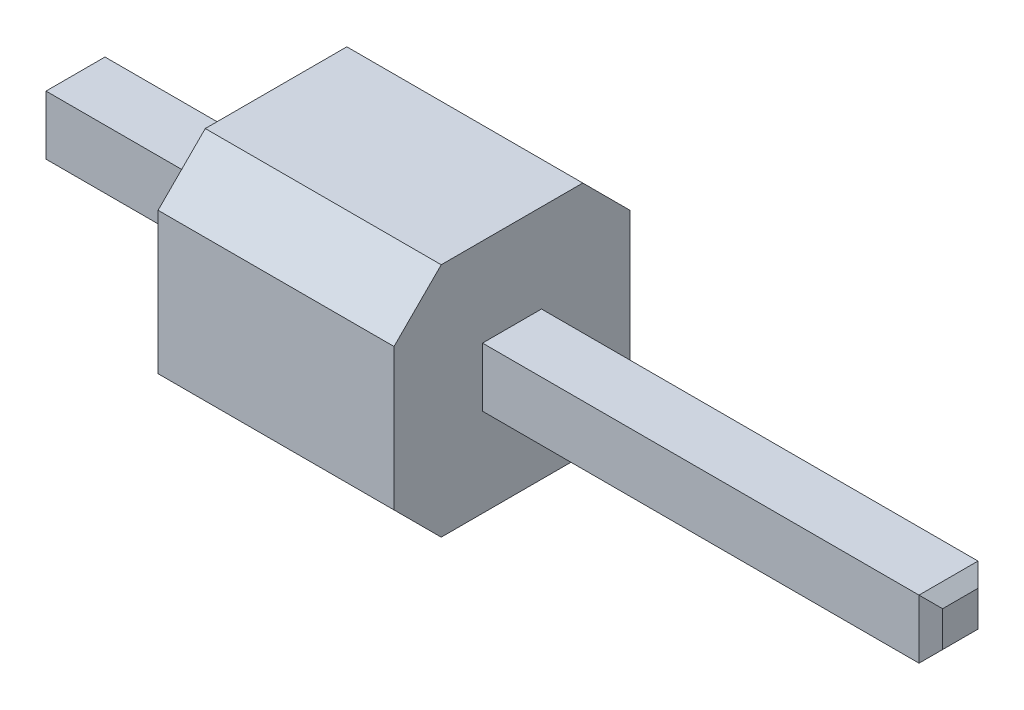
ISO-10303-21;
HEADER;
FILE_DESCRIPTION(('STEP AP214'),'2;1');
FILE_NAME('part.step','',(''),(''),'','','');
FILE_SCHEMA(('AUTOMOTIVE_DESIGN { 1 0 10303 214 1 1 1 1 }'));
ENDSEC;
DATA;
#1=APPLICATION_CONTEXT('core data for automotive mechanical design processes');
#2=APPLICATION_PROTOCOL_DEFINITION('international standard','automotive_design',2000,#1);
#3=PRODUCT_CONTEXT('',#1,'mechanical');
#4=PRODUCT('Part','Part','',(#3));
#5=PRODUCT_RELATED_PRODUCT_CATEGORY('part','',(#4));
#6=PRODUCT_DEFINITION_FORMATION('','',#4);
#7=PRODUCT_DEFINITION_CONTEXT('part definition',#1,'design');
#8=PRODUCT_DEFINITION('design','',#6,#7);
#9=PRODUCT_DEFINITION_SHAPE('','',#8);
#10=(LENGTH_UNIT() NAMED_UNIT(*) SI_UNIT(.MILLI.,.METRE.));
#11=(NAMED_UNIT(*) PLANE_ANGLE_UNIT() SI_UNIT($,.RADIAN.));
#12=(NAMED_UNIT(*) SI_UNIT($,.STERADIAN.) SOLID_ANGLE_UNIT());
#13=UNCERTAINTY_MEASURE_WITH_UNIT(LENGTH_MEASURE(1.E-05),#10,'distance_accuracy_value','');
#14=(GEOMETRIC_REPRESENTATION_CONTEXT(3) GLOBAL_UNCERTAINTY_ASSIGNED_CONTEXT((#13)) GLOBAL_UNIT_ASSIGNED_CONTEXT((#10,
#11,#12)) REPRESENTATION_CONTEXT('',''));
#15=CARTESIAN_POINT('',(0.,0.,0.));
#16=DIRECTION('',(0.,0.,1.));
#17=DIRECTION('',(1.,0.,0.));
#18=AXIS2_PLACEMENT_3D('',#15,#16,#17);
#19=CARTESIAN_POINT('',(2.,1.,1.6));
#20=DIRECTION('',(0.,-0.707106781186549,-0.707106781186546));
#21=DIRECTION('',(0.,0.707106781186546,-0.707106781186549));
#22=AXIS2_PLACEMENT_3D('',#19,#20,#21);
#23=PLANE('',#22);
#24=DIRECTION('',(0.,-0.707106781186546,0.707106781186549));
#25=VECTOR('',#24,1.);
#26=CARTESIAN_POINT('',(0.,1.,1.6));
#27=LINE('',#26,#25);
#28=CARTESIAN_POINT('',(0.,1.,1.6));
#29=VERTEX_POINT('',#28);
#30=CARTESIAN_POINT('',(0.,0.6,2.));
#31=VERTEX_POINT('',#30);
#32=EDGE_CURVE('E300',#29,#31,#27,.T.);
#33=ORIENTED_EDGE('',*,*,#32,.T.);
#34=DIRECTION('',(-1.,0.,0.));
#35=VECTOR('',#34,1.);
#36=CARTESIAN_POINT('',(2.,0.6,2.));
#37=LINE('',#36,#35);
#38=CARTESIAN_POINT('',(2.,0.6,2.));
#39=VERTEX_POINT('',#38);
#40=EDGE_CURVE('E196',#39,#31,#37,.T.);
#41=ORIENTED_EDGE('',*,*,#40,.F.);
#42=DIRECTION('',(0.,-0.707106781186546,0.707106781186549));
#43=VECTOR('',#42,1.);
#44=CARTESIAN_POINT('',(2.,1.,1.6));
#45=LINE('',#44,#43);
#46=CARTESIAN_POINT('',(2.,1.,1.6));
#47=VERTEX_POINT('',#46);
#48=EDGE_CURVE('E301',#47,#39,#45,.T.);
#49=ORIENTED_EDGE('',*,*,#48,.F.);
#50=DIRECTION('',(-1.,0.,0.));
#51=VECTOR('',#50,1.);
#52=CARTESIAN_POINT('',(2.,1.,1.6));
#53=LINE('',#52,#51);
#54=EDGE_CURVE('E319',#47,#29,#53,.T.);
#55=ORIENTED_EDGE('',*,*,#54,.T.);
#56=EDGE_LOOP('',(#33,#41,#49,#55));
#57=FACE_BOUND('',#56,.T.);
#58=ADVANCED_FACE('F35',(#57),#23,.F.);
#59=CARTESIAN_POINT('',(2.,0.6,2.));
#60=DIRECTION('',(0.,0.,-1.));
#61=DIRECTION('',(-1.,0.,0.));
#62=AXIS2_PLACEMENT_3D('',#59,#60,#61);
#63=PLANE('',#62);
#64=DIRECTION('',(0.,-1.,0.));
#65=VECTOR('',#64,1.);
#66=CARTESIAN_POINT('',(0.,0.6,2.));
#67=LINE('',#66,#65);
#68=CARTESIAN_POINT('',(0.,-0.6,2.));
#69=VERTEX_POINT('',#68);
#70=EDGE_CURVE('E322',#31,#69,#67,.T.);
#71=ORIENTED_EDGE('',*,*,#70,.T.);
#72=DIRECTION('',(-1.,0.,0.));
#73=VECTOR('',#72,1.);
#74=CARTESIAN_POINT('',(2.,-0.6,2.));
#75=LINE('',#74,#73);
#76=CARTESIAN_POINT('',(2.,-0.6,2.));
#77=VERTEX_POINT('',#76);
#78=EDGE_CURVE('E352',#77,#69,#75,.T.);
#79=ORIENTED_EDGE('',*,*,#78,.F.);
#80=DIRECTION('',(0.,-1.,0.));
#81=VECTOR('',#80,1.);
#82=CARTESIAN_POINT('',(2.,0.6,2.));
#83=LINE('',#82,#81);
#84=EDGE_CURVE('E304',#39,#77,#83,.T.);
#85=ORIENTED_EDGE('',*,*,#84,.F.);
#86=ORIENTED_EDGE('',*,*,#40,.T.);
#87=EDGE_LOOP('',(#71,#79,#85,#86));
#88=FACE_BOUND('',#87,.T.);
#89=ADVANCED_FACE('F358',(#88),#63,.F.);
#90=CARTESIAN_POINT('',(2.,-1.,1.6));
#91=DIRECTION('',(0.,0.707106781186549,-0.707106781186546));
#92=DIRECTION('',(0.,0.707106781186546,0.707106781186549));
#93=AXIS2_PLACEMENT_3D('',#90,#91,#92);
#94=PLANE('',#93);
#95=DIRECTION('',(0.,-0.707106781186546,-0.707106781186549));
#96=VECTOR('',#95,1.);
#97=CARTESIAN_POINT('',(0.,-1.,1.6));
#98=LINE('',#97,#96);
#99=CARTESIAN_POINT('',(0.,-1.,1.6));
#100=VERTEX_POINT('',#99);
#101=EDGE_CURVE('E324',#69,#100,#98,.T.);
#102=ORIENTED_EDGE('',*,*,#101,.T.);
#103=DIRECTION('',(-1.,0.,0.));
#104=VECTOR('',#103,1.);
#105=CARTESIAN_POINT('',(2.,-1.,1.6));
#106=LINE('',#105,#104);
#107=CARTESIAN_POINT('',(2.,-1.,1.6));
#108=VERTEX_POINT('',#107);
#109=EDGE_CURVE('E349',#108,#100,#106,.T.);
#110=ORIENTED_EDGE('',*,*,#109,.F.);
#111=DIRECTION('',(0.,-0.707106781186546,-0.707106781186549));
#112=VECTOR('',#111,1.);
#113=CARTESIAN_POINT('',(2.,-1.,1.6));
#114=LINE('',#113,#112);
#115=EDGE_CURVE('E307',#77,#108,#114,.T.);
#116=ORIENTED_EDGE('',*,*,#115,.F.);
#117=ORIENTED_EDGE('',*,*,#78,.T.);
#118=EDGE_LOOP('',(#102,#110,#116,#117));
#119=FACE_BOUND('',#118,.T.);
#120=ADVANCED_FACE('F371',(#119),#94,.F.);
#121=CARTESIAN_POINT('',(2.,-1.,1.6));
#122=DIRECTION('',(0.,1.,0.));
#123=DIRECTION('',(0.,0.,1.));
#124=AXIS2_PLACEMENT_3D('',#121,#122,#123);
#125=PLANE('',#124);
#126=DIRECTION('',(0.,0.,-1.));
#127=VECTOR('',#126,1.);
#128=CARTESIAN_POINT('',(0.,-1.,1.6));
#129=LINE('',#128,#127);
#130=CARTESIAN_POINT('',(0.,-1.,0.400000000000001));
#131=VERTEX_POINT('',#130);
#132=EDGE_CURVE('E326',#100,#131,#129,.T.);
#133=ORIENTED_EDGE('',*,*,#132,.T.);
#134=DIRECTION('',(-1.,0.,0.));
#135=VECTOR('',#134,1.);
#136=CARTESIAN_POINT('',(2.,-1.,0.400000000000001));
#137=LINE('',#136,#135);
#138=CARTESIAN_POINT('',(2.,-1.,0.400000000000001));
#139=VERTEX_POINT('',#138);
#140=EDGE_CURVE('E346',#139,#131,#137,.T.);
#141=ORIENTED_EDGE('',*,*,#140,.F.);
#142=DIRECTION('',(0.,0.,-1.));
#143=VECTOR('',#142,1.);
#144=CARTESIAN_POINT('',(2.,-1.,1.6));
#145=LINE('',#144,#143);
#146=EDGE_CURVE('E309',#108,#139,#145,.T.);
#147=ORIENTED_EDGE('',*,*,#146,.F.);
#148=ORIENTED_EDGE('',*,*,#109,.T.);
#149=EDGE_LOOP('',(#133,#141,#147,#148));
#150=FACE_BOUND('',#149,.T.);
#151=ADVANCED_FACE('F375',(#150),#125,.F.);
#152=CARTESIAN_POINT('',(2.,-1.,0.400000000000001));
#153=DIRECTION('',(0.,0.707106781186549,0.707106781186546));
#154=DIRECTION('',(0.,-0.707106781186546,0.707106781186549));
#155=AXIS2_PLACEMENT_3D('',#152,#153,#154);
#156=PLANE('',#155);
#157=DIRECTION('',(0.,0.707106781186546,-0.707106781186549));
#158=VECTOR('',#157,1.);
#159=CARTESIAN_POINT('',(0.,-1.,0.400000000000001));
#160=LINE('',#159,#158);
#161=CARTESIAN_POINT('',(0.,-0.6,0.));
#162=VERTEX_POINT('',#161);
#163=EDGE_CURVE('E328',#131,#162,#160,.T.);
#164=ORIENTED_EDGE('',*,*,#163,.T.);
#165=DIRECTION('',(-1.,0.,0.));
#166=VECTOR('',#165,1.);
#167=CARTESIAN_POINT('',(2.,-0.6,0.));
#168=LINE('',#167,#166);
#169=CARTESIAN_POINT('',(2.,-0.6,0.));
#170=VERTEX_POINT('',#169);
#171=EDGE_CURVE('E343',#170,#162,#168,.T.);
#172=ORIENTED_EDGE('',*,*,#171,.F.);
#173=DIRECTION('',(0.,0.707106781186546,-0.707106781186549));
#174=VECTOR('',#173,1.);
#175=CARTESIAN_POINT('',(2.,-1.,0.400000000000001));
#176=LINE('',#175,#174);
#177=EDGE_CURVE('E311',#139,#170,#176,.T.);
#178=ORIENTED_EDGE('',*,*,#177,.F.);
#179=ORIENTED_EDGE('',*,*,#140,.T.);
#180=EDGE_LOOP('',(#164,#172,#178,#179));
#181=FACE_BOUND('',#180,.T.);
#182=ADVANCED_FACE('F394',(#181),#156,.F.);
#183=CARTESIAN_POINT('',(2.,0.6,0.));
#184=DIRECTION('',(0.,0.,1.));
#185=DIRECTION('',(0.,-1.,0.));
#186=AXIS2_PLACEMENT_3D('',#183,#184,#185);
#187=PLANE('',#186);
#188=DIRECTION('',(0.,1.,0.));
#189=VECTOR('',#188,1.);
#190=CARTESIAN_POINT('',(0.,0.6,0.));
#191=LINE('',#190,#189);
#192=CARTESIAN_POINT('',(0.,0.6,0.));
#193=VERTEX_POINT('',#192);
#194=EDGE_CURVE('E330',#162,#193,#191,.T.);
#195=ORIENTED_EDGE('',*,*,#194,.T.);
#196=DIRECTION('',(-1.,0.,0.));
#197=VECTOR('',#196,1.);
#198=CARTESIAN_POINT('',(2.,0.6,0.));
#199=LINE('',#198,#197);
#200=CARTESIAN_POINT('',(2.,0.6,0.));
#201=VERTEX_POINT('',#200);
#202=EDGE_CURVE('E340',#201,#193,#199,.T.);
#203=ORIENTED_EDGE('',*,*,#202,.F.);
#204=DIRECTION('',(0.,1.,0.));
#205=VECTOR('',#204,1.);
#206=CARTESIAN_POINT('',(2.,0.6,0.));
#207=LINE('',#206,#205);
#208=EDGE_CURVE('E313',#170,#201,#207,.T.);
#209=ORIENTED_EDGE('',*,*,#208,.F.);
#210=ORIENTED_EDGE('',*,*,#171,.T.);
#211=EDGE_LOOP('',(#195,#203,#209,#210));
#212=FACE_BOUND('',#211,.T.);
#213=ADVANCED_FACE('F391',(#212),#187,.F.);
#214=CARTESIAN_POINT('',(2.,1.,0.400000000000001));
#215=DIRECTION('',(0.,-0.707106781186549,0.707106781186546));
#216=DIRECTION('',(0.,-0.707106781186546,-0.707106781186549));
#217=AXIS2_PLACEMENT_3D('',#214,#215,#216);
#218=PLANE('',#217);
#219=DIRECTION('',(0.,0.707106781186546,0.707106781186549));
#220=VECTOR('',#219,1.);
#221=CARTESIAN_POINT('',(0.,1.,0.400000000000001));
#222=LINE('',#221,#220);
#223=CARTESIAN_POINT('',(0.,1.,0.400000000000001));
#224=VERTEX_POINT('',#223);
#225=EDGE_CURVE('E332',#193,#224,#222,.T.);
#226=ORIENTED_EDGE('',*,*,#225,.T.);
#227=DIRECTION('',(-1.,0.,0.));
#228=VECTOR('',#227,1.);
#229=CARTESIAN_POINT('',(2.,1.,0.400000000000001));
#230=LINE('',#229,#228);
#231=CARTESIAN_POINT('',(2.,1.,0.400000000000001));
#232=VERTEX_POINT('',#231);
#233=EDGE_CURVE('E337',#232,#224,#230,.T.);
#234=ORIENTED_EDGE('',*,*,#233,.F.);
#235=DIRECTION('',(0.,0.707106781186546,0.707106781186549));
#236=VECTOR('',#235,1.);
#237=CARTESIAN_POINT('',(2.,1.,0.400000000000001));
#238=LINE('',#237,#236);
#239=EDGE_CURVE('E315',#201,#232,#238,.T.);
#240=ORIENTED_EDGE('',*,*,#239,.F.);
#241=ORIENTED_EDGE('',*,*,#202,.T.);
#242=EDGE_LOOP('',(#226,#234,#240,#241));
#243=FACE_BOUND('',#242,.T.);
#244=ADVANCED_FACE('F387',(#243),#218,.F.);
#245=CARTESIAN_POINT('',(2.,1.,1.6));
#246=DIRECTION('',(0.,-1.,0.));
#247=DIRECTION('',(0.,0.,-1.));
#248=AXIS2_PLACEMENT_3D('',#245,#246,#247);
#249=PLANE('',#248);
#250=DIRECTION('',(0.,0.,1.));
#251=VECTOR('',#250,1.);
#252=CARTESIAN_POINT('',(0.,1.,1.6));
#253=LINE('',#252,#251);
#254=EDGE_CURVE('E305',#224,#29,#253,.T.);
#255=ORIENTED_EDGE('',*,*,#254,.T.);
#256=ORIENTED_EDGE('',*,*,#54,.F.);
#257=DIRECTION('',(0.,0.,1.));
#258=VECTOR('',#257,1.);
#259=CARTESIAN_POINT('',(2.,1.,1.6));
#260=LINE('',#259,#258);
#261=EDGE_CURVE('E317',#232,#47,#260,.T.);
#262=ORIENTED_EDGE('',*,*,#261,.F.);
#263=ORIENTED_EDGE('',*,*,#233,.T.);
#264=EDGE_LOOP('',(#255,#256,#262,#263));
#265=FACE_BOUND('',#264,.T.);
#266=ADVANCED_FACE('F385',(#265),#249,.F.);
#267=CARTESIAN_POINT('',(2.,0.,0.));
#268=DIRECTION('',(-1.,0.,0.));
#269=DIRECTION('',(0.,0.,1.));
#270=AXIS2_PLACEMENT_3D('',#267,#268,#269);
#271=PLANE('',#270);
#272=DIRECTION('',(0.,-1.,0.));
#273=VECTOR('',#272,1.);
#274=CARTESIAN_POINT('',(2.,0.,1.25));
#275=LINE('',#274,#273);
#276=CARTESIAN_POINT('',(2.,0.25,1.25));
#277=VERTEX_POINT('',#276);
#278=CARTESIAN_POINT('',(2.,-0.25,1.25));
#279=VERTEX_POINT('',#278);
#280=EDGE_CURVE('E297',#277,#279,#275,.T.);
#281=ORIENTED_EDGE('',*,*,#280,.F.);
#282=DIRECTION('',(0.,0.,-1.));
#283=VECTOR('',#282,1.);
#284=CARTESIAN_POINT('',(2.,0.25,0.));
#285=LINE('',#284,#283);
#286=CARTESIAN_POINT('',(2.,0.25,0.75));
#287=VERTEX_POINT('',#286);
#288=EDGE_CURVE('E287',#277,#287,#285,.T.);
#289=ORIENTED_EDGE('',*,*,#288,.T.);
#290=DIRECTION('',(0.,1.,0.));
#291=VECTOR('',#290,1.);
#292=CARTESIAN_POINT('',(2.,0.,0.75));
#293=LINE('',#292,#291);
#294=CARTESIAN_POINT('',(2.,-0.25,0.75));
#295=VERTEX_POINT('',#294);
#296=EDGE_CURVE('E282',#295,#287,#293,.T.);
#297=ORIENTED_EDGE('',*,*,#296,.F.);
#298=DIRECTION('',(0.,0.,-1.));
#299=VECTOR('',#298,1.);
#300=CARTESIAN_POINT('',(2.,-0.25,0.));
#301=LINE('',#300,#299);
#302=EDGE_CURVE('E283',#279,#295,#301,.T.);
#303=ORIENTED_EDGE('',*,*,#302,.F.);
#304=EDGE_LOOP('',(#281,#289,#297,#303));
#305=FACE_BOUND('',#304,.T.);
#306=ORIENTED_EDGE('',*,*,#48,.T.);
#307=ORIENTED_EDGE('',*,*,#84,.T.);
#308=ORIENTED_EDGE('',*,*,#115,.T.);
#309=ORIENTED_EDGE('',*,*,#146,.T.);
#310=ORIENTED_EDGE('',*,*,#177,.T.);
#311=ORIENTED_EDGE('',*,*,#208,.T.);
#312=ORIENTED_EDGE('',*,*,#239,.T.);
#313=ORIENTED_EDGE('',*,*,#261,.T.);
#314=EDGE_LOOP('',(#306,#307,#308,#309,#310,#311,#312,#313));
#315=FACE_BOUND('',#314,.T.);
#316=ADVANCED_FACE('F379',(#305,#315),#271,.F.);
#317=CARTESIAN_POINT('',(0.,0.,0.));
#318=DIRECTION('',(-1.,0.,0.));
#319=DIRECTION('',(0.,0.,1.));
#320=AXIS2_PLACEMENT_3D('',#317,#318,#319);
#321=PLANE('',#320);
#322=DIRECTION('',(0.,0.,-1.));
#323=VECTOR('',#322,1.);
#324=CARTESIAN_POINT('',(0.,0.25,0.));
#325=LINE('',#324,#323);
#326=CARTESIAN_POINT('',(0.,0.25,1.25));
#327=VERTEX_POINT('',#326);
#328=CARTESIAN_POINT('',(0.,0.25,0.75));
#329=VERTEX_POINT('',#328);
#330=EDGE_CURVE('E200',#327,#329,#325,.T.);
#331=ORIENTED_EDGE('',*,*,#330,.F.);
#332=DIRECTION('',(0.,-1.,0.));
#333=VECTOR('',#332,1.);
#334=CARTESIAN_POINT('',(0.,0.,1.25));
#335=LINE('',#334,#333);
#336=CARTESIAN_POINT('',(0.,-0.25,1.25));
#337=VERTEX_POINT('',#336);
#338=EDGE_CURVE('E178',#327,#337,#335,.T.);
#339=ORIENTED_EDGE('',*,*,#338,.T.);
#340=DIRECTION('',(0.,0.,-1.));
#341=VECTOR('',#340,1.);
#342=CARTESIAN_POINT('',(0.,-0.25,0.));
#343=LINE('',#342,#341);
#344=CARTESIAN_POINT('',(0.,-0.25,0.75));
#345=VERTEX_POINT('',#344);
#346=EDGE_CURVE('E189',#337,#345,#343,.T.);
#347=ORIENTED_EDGE('',*,*,#346,.T.);
#348=DIRECTION('',(0.,1.,0.));
#349=VECTOR('',#348,1.);
#350=CARTESIAN_POINT('',(0.,0.,0.75));
#351=LINE('',#350,#349);
#352=EDGE_CURVE('E195',#345,#329,#351,.T.);
#353=ORIENTED_EDGE('',*,*,#352,.T.);
#354=EDGE_LOOP('',(#331,#339,#347,#353));
#355=FACE_BOUND('',#354,.T.);
#356=ORIENTED_EDGE('',*,*,#32,.F.);
#357=ORIENTED_EDGE('',*,*,#254,.F.);
#358=ORIENTED_EDGE('',*,*,#225,.F.);
#359=ORIENTED_EDGE('',*,*,#194,.F.);
#360=ORIENTED_EDGE('',*,*,#163,.F.);
#361=ORIENTED_EDGE('',*,*,#132,.F.);
#362=ORIENTED_EDGE('',*,*,#101,.F.);
#363=ORIENTED_EDGE('',*,*,#70,.F.);
#364=EDGE_LOOP('',(#356,#357,#358,#359,#360,#361,#362,#363));
#365=FACE_BOUND('',#364,.T.);
#366=ADVANCED_FACE('F198',(#355,#365),#321,.T.);
#367=CARTESIAN_POINT('',(-1.8,0.25,0.75));
#368=DIRECTION('',(1.,0.,0.));
#369=DIRECTION('',(0.,0.,-1.));
#370=AXIS2_PLACEMENT_3D('',#367,#368,#369);
#371=PLANE('',#370);
#372=DIRECTION('',(0.,-1.,0.));
#373=VECTOR('',#372,1.);
#374=CARTESIAN_POINT('',(-1.8,0.25,0.850000000000001));
#375=LINE('',#374,#373);
#376=CARTESIAN_POINT('',(-1.8,0.149999999999999,0.850000000000001));
#377=VERTEX_POINT('',#376);
#378=CARTESIAN_POINT('',(-1.8,-0.149999999999999,0.850000000000001));
#379=VERTEX_POINT('',#378);
#380=EDGE_CURVE('E209',#377,#379,#375,.T.);
#381=ORIENTED_EDGE('',*,*,#380,.T.);
#382=DIRECTION('',(0.,0.,1.));
#383=VECTOR('',#382,1.);
#384=CARTESIAN_POINT('',(-1.8,-0.149999999999999,0.75));
#385=LINE('',#384,#383);
#386=CARTESIAN_POINT('',(-1.8,-0.149999999999999,1.15));
#387=VERTEX_POINT('',#386);
#388=EDGE_CURVE('E211',#379,#387,#385,.T.);
#389=ORIENTED_EDGE('',*,*,#388,.T.);
#390=DIRECTION('',(0.,1.,0.));
#391=VECTOR('',#390,1.);
#392=CARTESIAN_POINT('',(-1.8,0.25,1.15));
#393=LINE('',#392,#391);
#394=CARTESIAN_POINT('',(-1.8,0.149999999999999,1.15));
#395=VERTEX_POINT('',#394);
#396=EDGE_CURVE('E202',#387,#395,#393,.T.);
#397=ORIENTED_EDGE('',*,*,#396,.T.);
#398=DIRECTION('',(0.,0.,-1.));
#399=VECTOR('',#398,1.);
#400=CARTESIAN_POINT('',(-1.8,0.149999999999999,0.75));
#401=LINE('',#400,#399);
#402=EDGE_CURVE('E207',#395,#377,#401,.T.);
#403=ORIENTED_EDGE('',*,*,#402,.T.);
#404=EDGE_LOOP('',(#381,#389,#397,#403));
#405=FACE_BOUND('',#404,.T.);
#406=ADVANCED_FACE('F509',(#405),#371,.F.);
#407=CARTESIAN_POINT('',(0.,0.25,0.));
#408=DIRECTION('',(0.,1.,0.));
#409=DIRECTION('',(0.,0.,1.));
#410=AXIS2_PLACEMENT_3D('',#407,#408,#409);
#411=PLANE('',#410);
#412=DIRECTION('',(-1.,0.,0.));
#413=VECTOR('',#412,1.);
#414=CARTESIAN_POINT('',(-1.8,0.25,0.75));
#415=LINE('',#414,#413);
#416=CARTESIAN_POINT('',(-1.7,0.25,0.75));
#417=VERTEX_POINT('',#416);
#418=EDGE_CURVE('E284',#329,#417,#415,.T.);
#419=ORIENTED_EDGE('',*,*,#418,.T.);
#420=DIRECTION('',(0.,0.,1.));
#421=VECTOR('',#420,1.);
#422=CARTESIAN_POINT('',(-1.7,0.25,1.25));
#423=LINE('',#422,#421);
#424=CARTESIAN_POINT('',(-1.7,0.25,1.25));
#425=VERTEX_POINT('',#424);
#426=EDGE_CURVE('E218',#417,#425,#423,.T.);
#427=ORIENTED_EDGE('',*,*,#426,.T.);
#428=DIRECTION('',(1.,0.,0.));
#429=VECTOR('',#428,1.);
#430=CARTESIAN_POINT('',(-1.8,0.25,1.25));
#431=LINE('',#430,#429);
#432=EDGE_CURVE('E290',#425,#327,#431,.T.);
#433=ORIENTED_EDGE('',*,*,#432,.T.);
#434=ORIENTED_EDGE('',*,*,#330,.T.);
#435=EDGE_LOOP('',(#419,#427,#433,#434));
#436=FACE_BOUND('',#435,.T.);
#437=ADVANCED_FACE('F472',(#436),#411,.T.);
#438=CARTESIAN_POINT('',(0.,-0.25,0.));
#439=DIRECTION('',(0.,1.,0.));
#440=DIRECTION('',(0.,0.,1.));
#441=AXIS2_PLACEMENT_3D('',#438,#439,#440);
#442=PLANE('',#441);
#443=DIRECTION('',(1.,0.,0.));
#444=VECTOR('',#443,1.);
#445=CARTESIAN_POINT('',(-1.8,-0.25,1.25));
#446=LINE('',#445,#444);
#447=CARTESIAN_POINT('',(-1.7,-0.25,1.25));
#448=VERTEX_POINT('',#447);
#449=EDGE_CURVE('E173',#448,#337,#446,.T.);
#450=ORIENTED_EDGE('',*,*,#449,.F.);
#451=DIRECTION('',(0.,0.,-1.));
#452=VECTOR('',#451,1.);
#453=CARTESIAN_POINT('',(-1.7,-0.25,0.));
#454=LINE('',#453,#452);
#455=CARTESIAN_POINT('',(-1.7,-0.25,0.75));
#456=VERTEX_POINT('',#455);
#457=EDGE_CURVE('E214',#448,#456,#454,.T.);
#458=ORIENTED_EDGE('',*,*,#457,.T.);
#459=DIRECTION('',(-1.,0.,0.));
#460=VECTOR('',#459,1.);
#461=CARTESIAN_POINT('',(-1.8,-0.25,0.75));
#462=LINE('',#461,#460);
#463=EDGE_CURVE('E185',#345,#456,#462,.T.);
#464=ORIENTED_EDGE('',*,*,#463,.F.);
#465=ORIENTED_EDGE('',*,*,#346,.F.);
#466=EDGE_LOOP('',(#450,#458,#464,#465));
#467=FACE_BOUND('',#466,.T.);
#468=ADVANCED_FACE('F190',(#467),#442,.F.);
#469=CARTESIAN_POINT('',(-1.8,0.25,0.75));
#470=DIRECTION('',(0.,0.,1.));
#471=DIRECTION('',(1.,0.,0.));
#472=AXIS2_PLACEMENT_3D('',#469,#470,#471);
#473=PLANE('',#472);
#474=ORIENTED_EDGE('',*,*,#463,.T.);
#475=DIRECTION('',(0.,1.,0.));
#476=VECTOR('',#475,1.);
#477=CARTESIAN_POINT('',(-1.7,0.25,0.75));
#478=LINE('',#477,#476);
#479=EDGE_CURVE('E216',#456,#417,#478,.T.);
#480=ORIENTED_EDGE('',*,*,#479,.T.);
#481=ORIENTED_EDGE('',*,*,#418,.F.);
#482=ORIENTED_EDGE('',*,*,#352,.F.);
#483=EDGE_LOOP('',(#474,#480,#481,#482));
#484=FACE_BOUND('',#483,.T.);
#485=ADVANCED_FACE('F480',(#484),#473,.F.);
#486=CARTESIAN_POINT('',(-1.8,0.25,1.25));
#487=DIRECTION('',(0.,0.,-1.));
#488=DIRECTION('',(-1.,0.,0.));
#489=AXIS2_PLACEMENT_3D('',#486,#487,#488);
#490=PLANE('',#489);
#491=ORIENTED_EDGE('',*,*,#432,.F.);
#492=DIRECTION('',(0.,-1.,0.));
#493=VECTOR('',#492,1.);
#494=CARTESIAN_POINT('',(-1.7,0.25,1.25));
#495=LINE('',#494,#493);
#496=EDGE_CURVE('E181',#425,#448,#495,.T.);
#497=ORIENTED_EDGE('',*,*,#496,.T.);
#498=ORIENTED_EDGE('',*,*,#449,.T.);
#499=ORIENTED_EDGE('',*,*,#338,.F.);
#500=EDGE_LOOP('',(#491,#497,#498,#499));
#501=FACE_BOUND('',#500,.T.);
#502=ADVANCED_FACE('F176',(#501),#490,.F.);
#503=CARTESIAN_POINT('',(5.7,-0.25,1.25));
#504=VERTEX_POINT('',#503);
#505=EDGE_CURVE('E186',#279,#504,#446,.T.);
#506=ORIENTED_EDGE('',*,*,#505,.T.);
#507=DIRECTION('',(0.,1.,0.));
#508=VECTOR('',#507,1.);
#509=CARTESIAN_POINT('',(5.7,0.25,1.25));
#510=LINE('',#509,#508);
#511=CARTESIAN_POINT('',(5.7,0.25,1.25));
#512=VERTEX_POINT('',#511);
#513=EDGE_CURVE('E233',#504,#512,#510,.T.);
#514=ORIENTED_EDGE('',*,*,#513,.T.);
#515=EDGE_CURVE('E278',#277,#512,#431,.T.);
#516=ORIENTED_EDGE('',*,*,#515,.F.);
#517=ORIENTED_EDGE('',*,*,#280,.T.);
#518=EDGE_LOOP('',(#506,#514,#516,#517));
#519=FACE_BOUND('',#518,.T.);
#520=ADVANCED_FACE('F478',(#519),#490,.F.);
#521=CARTESIAN_POINT('',(5.7,0.25,0.75));
#522=VERTEX_POINT('',#521);
#523=EDGE_CURVE('E275',#522,#287,#415,.T.);
#524=ORIENTED_EDGE('',*,*,#523,.F.);
#525=DIRECTION('',(0.,-1.,0.));
#526=VECTOR('',#525,1.);
#527=CARTESIAN_POINT('',(5.7,0.25,0.75));
#528=LINE('',#527,#526);
#529=CARTESIAN_POINT('',(5.7,-0.25,0.75));
#530=VERTEX_POINT('',#529);
#531=EDGE_CURVE('E11',#522,#530,#528,.T.);
#532=ORIENTED_EDGE('',*,*,#531,.T.);
#533=EDGE_CURVE('E293',#530,#295,#462,.T.);
#534=ORIENTED_EDGE('',*,*,#533,.T.);
#535=ORIENTED_EDGE('',*,*,#296,.T.);
#536=EDGE_LOOP('',(#524,#532,#534,#535));
#537=FACE_BOUND('',#536,.T.);
#538=ADVANCED_FACE('F280',(#537),#473,.F.);
#539=ORIENTED_EDGE('',*,*,#515,.T.);
#540=DIRECTION('',(0.,0.,-1.));
#541=VECTOR('',#540,1.);
#542=CARTESIAN_POINT('',(5.7,0.25,0.75));
#543=LINE('',#542,#541);
#544=EDGE_CURVE('E221',#512,#522,#543,.T.);
#545=ORIENTED_EDGE('',*,*,#544,.T.);
#546=ORIENTED_EDGE('',*,*,#523,.T.);
#547=ORIENTED_EDGE('',*,*,#288,.F.);
#548=EDGE_LOOP('',(#539,#545,#546,#547));
#549=FACE_BOUND('',#548,.T.);
#550=ADVANCED_FACE('F273',(#549),#411,.T.);
#551=ORIENTED_EDGE('',*,*,#533,.F.);
#552=DIRECTION('',(0.,0.,1.));
#553=VECTOR('',#552,1.);
#554=CARTESIAN_POINT('',(5.7,-0.25,0.));
#555=LINE('',#554,#553);
#556=EDGE_CURVE('E44',#530,#504,#555,.T.);
#557=ORIENTED_EDGE('',*,*,#556,.T.);
#558=ORIENTED_EDGE('',*,*,#505,.F.);
#559=ORIENTED_EDGE('',*,*,#302,.T.);
#560=EDGE_LOOP('',(#551,#557,#558,#559));
#561=FACE_BOUND('',#560,.T.);
#562=ADVANCED_FACE('F458',(#561),#442,.F.);
#563=CARTESIAN_POINT('',(5.8,0.25,1.25));
#564=DIRECTION('',(-1.,0.,0.));
#565=DIRECTION('',(0.,0.,1.));
#566=AXIS2_PLACEMENT_3D('',#563,#564,#565);
#567=PLANE('',#566);
#568=DIRECTION('',(0.,1.,0.));
#569=VECTOR('',#568,1.);
#570=CARTESIAN_POINT('',(5.8,0.25,0.85));
#571=LINE('',#570,#569);
#572=CARTESIAN_POINT('',(5.8,-0.15,0.85));
#573=VERTEX_POINT('',#572);
#574=CARTESIAN_POINT('',(5.8,0.15,0.85));
#575=VERTEX_POINT('',#574);
#576=EDGE_CURVE('E224',#573,#575,#571,.T.);
#577=ORIENTED_EDGE('',*,*,#576,.T.);
#578=DIRECTION('',(0.,0.,1.));
#579=VECTOR('',#578,1.);
#580=CARTESIAN_POINT('',(5.8,0.15,1.25));
#581=LINE('',#580,#579);
#582=CARTESIAN_POINT('',(5.8,0.15,1.15));
#583=VERTEX_POINT('',#582);
#584=EDGE_CURVE('E230',#575,#583,#581,.T.);
#585=ORIENTED_EDGE('',*,*,#584,.T.);
#586=DIRECTION('',(0.,-1.,0.));
#587=VECTOR('',#586,1.);
#588=CARTESIAN_POINT('',(5.8,0.25,1.15));
#589=LINE('',#588,#587);
#590=CARTESIAN_POINT('',(5.8,-0.15,1.15));
#591=VERTEX_POINT('',#590);
#592=EDGE_CURVE('E228',#583,#591,#589,.T.);
#593=ORIENTED_EDGE('',*,*,#592,.T.);
#594=DIRECTION('',(0.,0.,-1.));
#595=VECTOR('',#594,1.);
#596=CARTESIAN_POINT('',(5.8,-0.15,1.25));
#597=LINE('',#596,#595);
#598=EDGE_CURVE('E226',#591,#573,#597,.T.);
#599=ORIENTED_EDGE('',*,*,#598,.T.);
#600=EDGE_LOOP('',(#577,#585,#593,#599));
#601=FACE_BOUND('',#600,.T.);
#602=ADVANCED_FACE('F264',(#601),#567,.F.);
#603=CARTESIAN_POINT('',(-1.7,0.25,0.));
#604=DIRECTION('',(-0.707106781186551,0.707106781186544,0.));
#605=DIRECTION('',(0.,0.,-1.));
#606=AXIS2_PLACEMENT_3D('',#603,#604,#605);
#607=PLANE('',#606);
#608=DIRECTION('',(0.577350269189622,0.577350269189627,0.577350269189627));
#609=VECTOR('',#608,1.);
#610=CARTESIAN_POINT('',(-1.7,0.25,1.25));
#611=LINE('',#610,#609);
#612=EDGE_CURVE('E240',#425,#395,#611,.F.);
#613=ORIENTED_EDGE('',*,*,#612,.F.);
#614=ORIENTED_EDGE('',*,*,#426,.F.);
#615=DIRECTION('',(0.577350269189622,0.577350269189627,-0.577350269189627));
#616=VECTOR('',#615,1.);
#617=CARTESIAN_POINT('',(-1.45,0.500000000000001,0.499999999999998));
#618=LINE('',#617,#616);
#619=EDGE_CURVE('E243',#377,#417,#618,.T.);
#620=ORIENTED_EDGE('',*,*,#619,.F.);
#621=ORIENTED_EDGE('',*,*,#402,.F.);
#622=EDGE_LOOP('',(#613,#614,#620,#621));
#623=FACE_BOUND('',#622,.T.);
#624=ADVANCED_FACE('F422',(#623),#607,.T.);
#625=CARTESIAN_POINT('',(-1.8,0.25,0.850000000000001));
#626=DIRECTION('',(0.707106781186551,0.,0.707106781186544));
#627=DIRECTION('',(0.,-1.,0.));
#628=AXIS2_PLACEMENT_3D('',#625,#626,#627);
#629=PLANE('',#628);
#630=ORIENTED_EDGE('',*,*,#619,.T.);
#631=ORIENTED_EDGE('',*,*,#479,.F.);
#632=DIRECTION('',(-0.577350269189622,0.577350269189627,0.577350269189627));
#633=VECTOR('',#632,1.);
#634=CARTESIAN_POINT('',(-1.93333333333333,-0.0166666666666652,0.983333333333335));
#635=LINE('',#634,#633);
#636=EDGE_CURVE('E238',#379,#456,#635,.F.);
#637=ORIENTED_EDGE('',*,*,#636,.F.);
#638=ORIENTED_EDGE('',*,*,#380,.F.);
#639=EDGE_LOOP('',(#630,#631,#637,#638));
#640=FACE_BOUND('',#639,.T.);
#641=ADVANCED_FACE('F418',(#640),#629,.F.);
#642=CARTESIAN_POINT('',(-1.7,0.25,1.25));
#643=DIRECTION('',(0.707106781186551,0.,-0.707106781186544));
#644=DIRECTION('',(0.,-1.,0.));
#645=AXIS2_PLACEMENT_3D('',#642,#643,#644);
#646=PLANE('',#645);
#647=ORIENTED_EDGE('',*,*,#612,.T.);
#648=ORIENTED_EDGE('',*,*,#396,.F.);
#649=DIRECTION('',(0.577350269189622,-0.577350269189627,0.577350269189627));
#650=VECTOR('',#649,1.);
#651=CARTESIAN_POINT('',(-1.86666666666667,-0.0833333333333324,1.08333333333333));
#652=LINE('',#651,#650);
#653=EDGE_CURVE('E236',#448,#387,#652,.F.);
#654=ORIENTED_EDGE('',*,*,#653,.F.);
#655=ORIENTED_EDGE('',*,*,#496,.F.);
#656=EDGE_LOOP('',(#647,#648,#654,#655));
#657=FACE_BOUND('',#656,.T.);
#658=ADVANCED_FACE('F414',(#657),#646,.F.);
#659=CARTESIAN_POINT('',(-1.8,-0.149999999999999,0.75));
#660=DIRECTION('',(0.707106781186551,0.707106781186544,0.));
#661=DIRECTION('',(0.,0.,1.));
#662=AXIS2_PLACEMENT_3D('',#659,#660,#661);
#663=PLANE('',#662);
#664=ORIENTED_EDGE('',*,*,#636,.T.);
#665=ORIENTED_EDGE('',*,*,#457,.F.);
#666=ORIENTED_EDGE('',*,*,#653,.T.);
#667=ORIENTED_EDGE('',*,*,#388,.F.);
#668=EDGE_LOOP('',(#664,#665,#666,#667));
#669=FACE_BOUND('',#668,.T.);
#670=ADVANCED_FACE('F411',(#669),#663,.F.);
#671=CARTESIAN_POINT('',(5.8,-0.15,1.25));
#672=DIRECTION('',(-0.707106781186547,0.707106781186547,0.));
#673=DIRECTION('',(0.,0.,-1.));
#674=AXIS2_PLACEMENT_3D('',#671,#672,#673);
#675=PLANE('',#674);
#676=DIRECTION('',(-0.577350269189626,-0.577350269189626,-0.577350269189626));
#677=VECTOR('',#676,1.);
#678=CARTESIAN_POINT('',(5.86666666666667,-0.0833333333333333,0.916666666666667));
#679=LINE('',#678,#677);
#680=EDGE_CURVE('E249',#573,#530,#679,.T.);
#681=ORIENTED_EDGE('',*,*,#680,.F.);
#682=ORIENTED_EDGE('',*,*,#598,.F.);
#683=DIRECTION('',(-0.577350269189626,-0.577350269189626,0.577350269189626));
#684=VECTOR('',#683,1.);
#685=CARTESIAN_POINT('',(5.76666666666667,-0.183333333333333,1.18333333333333));
#686=LINE('',#685,#684);
#687=EDGE_CURVE('E39',#504,#591,#686,.F.);
#688=ORIENTED_EDGE('',*,*,#687,.F.);
#689=ORIENTED_EDGE('',*,*,#556,.F.);
#690=EDGE_LOOP('',(#681,#682,#688,#689));
#691=FACE_BOUND('',#690,.T.);
#692=ADVANCED_FACE('F37',(#691),#675,.F.);
#693=CARTESIAN_POINT('',(5.8,0.25,1.15));
#694=DIRECTION('',(-0.707106781186547,0.,-0.707106781186547));
#695=DIRECTION('',(0.,-1.,0.));
#696=AXIS2_PLACEMENT_3D('',#693,#694,#695);
#697=PLANE('',#696);
#698=ORIENTED_EDGE('',*,*,#687,.T.);
#699=ORIENTED_EDGE('',*,*,#592,.F.);
#700=DIRECTION('',(0.577350269189626,-0.577350269189626,-0.577350269189626));
#701=VECTOR('',#700,1.);
#702=CARTESIAN_POINT('',(5.76666666666667,0.183333333333333,1.18333333333333));
#703=LINE('',#702,#701);
#704=EDGE_CURVE('E248',#512,#583,#703,.T.);
#705=ORIENTED_EDGE('',*,*,#704,.F.);
#706=ORIENTED_EDGE('',*,*,#513,.F.);
#707=EDGE_LOOP('',(#698,#699,#705,#706));
#708=FACE_BOUND('',#707,.T.);
#709=ADVANCED_FACE('F259',(#708),#697,.F.);
#710=CARTESIAN_POINT('',(5.7,0.25,0.75));
#711=DIRECTION('',(-0.707106781186547,0.,0.707106781186547));
#712=DIRECTION('',(0.,-1.,0.));
#713=AXIS2_PLACEMENT_3D('',#710,#711,#712);
#714=PLANE('',#713);
#715=ORIENTED_EDGE('',*,*,#680,.T.);
#716=ORIENTED_EDGE('',*,*,#531,.F.);
#717=DIRECTION('',(-0.577350269189626,0.577350269189626,-0.577350269189626));
#718=VECTOR('',#717,1.);
#719=CARTESIAN_POINT('',(5.7,0.25,0.75));
#720=LINE('',#719,#718);
#721=EDGE_CURVE('E246',#575,#522,#720,.T.);
#722=ORIENTED_EDGE('',*,*,#721,.F.);
#723=ORIENTED_EDGE('',*,*,#576,.F.);
#724=EDGE_LOOP('',(#715,#716,#722,#723));
#725=FACE_BOUND('',#724,.T.);
#726=ADVANCED_FACE('F270',(#725),#714,.F.);
#727=CARTESIAN_POINT('',(5.7,0.25,0.));
#728=DIRECTION('',(0.707106781186547,0.707106781186547,0.));
#729=DIRECTION('',(0.,0.,1.));
#730=AXIS2_PLACEMENT_3D('',#727,#728,#729);
#731=PLANE('',#730);
#732=ORIENTED_EDGE('',*,*,#704,.T.);
#733=ORIENTED_EDGE('',*,*,#584,.F.);
#734=ORIENTED_EDGE('',*,*,#721,.T.);
#735=ORIENTED_EDGE('',*,*,#544,.F.);
#736=EDGE_LOOP('',(#732,#733,#734,#735));
#737=FACE_BOUND('',#736,.T.);
#738=ADVANCED_FACE('F268',(#737),#731,.T.);
#739=CLOSED_SHELL('',(#58,#89,#120,#151,#182,#213,#244,#266,#316,#366,#406,#437,#468,#485,#502,
#520,#538,#550,#562,#602,#624,#641,#658,#670,#692,#709,#726,#738));
#740=MANIFOLD_SOLID_BREP('B2',#739);
#741=ADVANCED_BREP_SHAPE_REPRESENTATION('',(#18,#740),#14);
#742=SHAPE_DEFINITION_REPRESENTATION(#9,#741);
ENDSEC;
END-ISO-10303-21;
